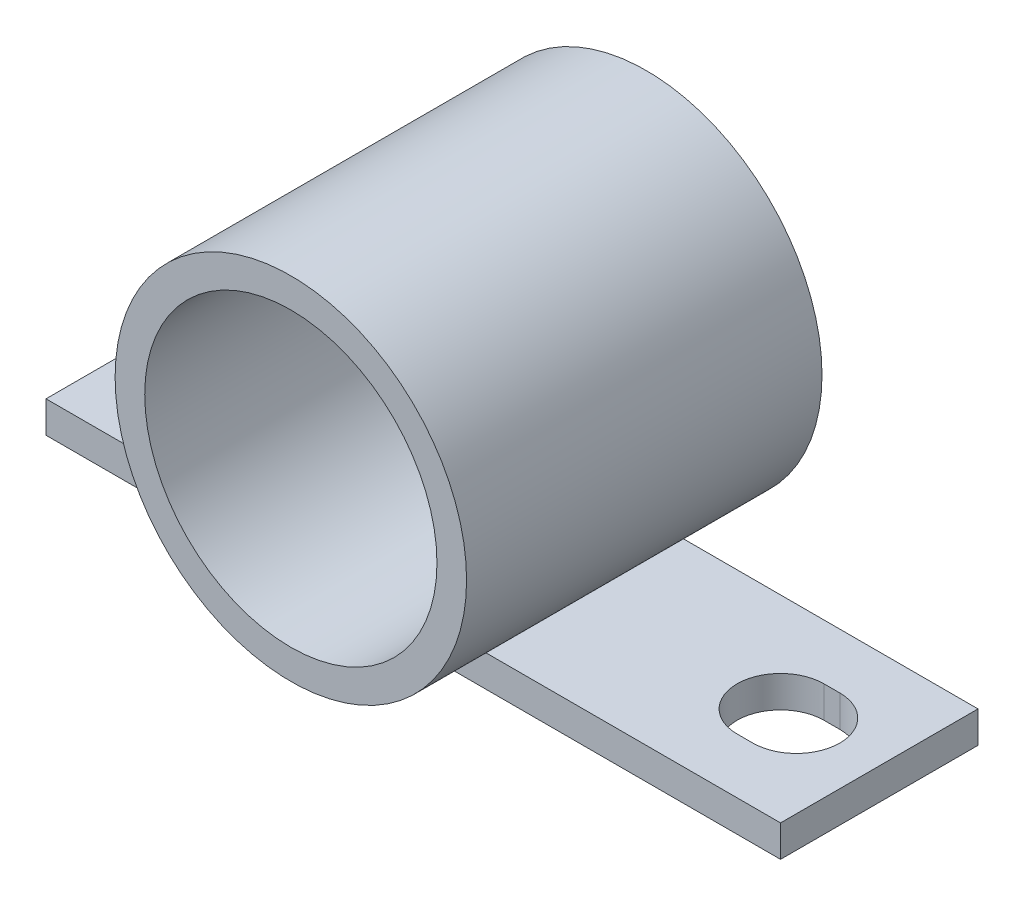
ISO-10303-21;
HEADER;
FILE_DESCRIPTION(('STEP AP214'),'2;1');
FILE_NAME('part.step','',(''),(''),'','','');
FILE_SCHEMA(('AUTOMOTIVE_DESIGN { 1 0 10303 214 1 1 1 1 }'));
ENDSEC;
DATA;
#1=APPLICATION_CONTEXT('core data for automotive mechanical design processes');
#2=APPLICATION_PROTOCOL_DEFINITION('international standard','automotive_design',2000,#1);
#3=PRODUCT_CONTEXT('',#1,'mechanical');
#4=PRODUCT('Part','Part','',(#3));
#5=PRODUCT_RELATED_PRODUCT_CATEGORY('part','',(#4));
#6=PRODUCT_DEFINITION_FORMATION('','',#4);
#7=PRODUCT_DEFINITION_CONTEXT('part definition',#1,'design');
#8=PRODUCT_DEFINITION('design','',#6,#7);
#9=PRODUCT_DEFINITION_SHAPE('','',#8);
#10=(LENGTH_UNIT() NAMED_UNIT(*) SI_UNIT(.MILLI.,.METRE.));
#11=(NAMED_UNIT(*) PLANE_ANGLE_UNIT() SI_UNIT($,.RADIAN.));
#12=(NAMED_UNIT(*) SI_UNIT($,.STERADIAN.) SOLID_ANGLE_UNIT());
#13=UNCERTAINTY_MEASURE_WITH_UNIT(LENGTH_MEASURE(1.E-05),#10,'distance_accuracy_value','');
#14=(GEOMETRIC_REPRESENTATION_CONTEXT(3) GLOBAL_UNCERTAINTY_ASSIGNED_CONTEXT((#13)) GLOBAL_UNIT_ASSIGNED_CONTEXT((#10,
#11,#12)) REPRESENTATION_CONTEXT('',''));
#15=CARTESIAN_POINT('',(0.,0.,0.));
#16=DIRECTION('',(0.,0.,1.));
#17=DIRECTION('',(1.,0.,0.));
#18=AXIS2_PLACEMENT_3D('',#15,#16,#17);
#19=CARTESIAN_POINT('',(0.,26.2500000000004,-17.0000000000001));
#20=DIRECTION('',(0.,0.,1.));
#21=DIRECTION('',(1.,0.,0.));
#22=AXIS2_PLACEMENT_3D('',#19,#20,#21);
#23=CYLINDRICAL_SURFACE('',#22,22.25);
#24=CARTESIAN_POINT('',(0.,26.2500000000004,-17.0000000000001));
#25=DIRECTION('',(0.,0.,1.));
#26=DIRECTION('',(1.,0.,0.));
#27=AXIS2_PLACEMENT_3D('',#24,#25,#26);
#28=CIRCLE('',#27,22.25);
#29=CARTESIAN_POINT('',(22.25,26.2500000000004,-17.0000000000001));
#30=VERTEX_POINT('',#29);
#31=EDGE_CURVE('E11',#30,#30,#28,.T.);
#32=ORIENTED_EDGE('',*,*,#31,.T.);
#33=EDGE_LOOP('',(#32));
#34=FACE_BOUND('',#33,.T.);
#35=CARTESIAN_POINT('',(0.,26.25,28.));
#36=DIRECTION('',(0.,0.,1.));
#37=DIRECTION('',(1.,0.,0.));
#38=AXIS2_PLACEMENT_3D('',#35,#36,#37);
#39=CIRCLE('',#38,22.25);
#40=CARTESIAN_POINT('',(22.25,26.25,28.));
#41=VERTEX_POINT('',#40);
#42=EDGE_CURVE('E54',#41,#41,#39,.T.);
#43=ORIENTED_EDGE('',*,*,#42,.F.);
#44=EDGE_LOOP('',(#43));
#45=FACE_BOUND('',#44,.T.);
#46=ADVANCED_FACE('F44',(#34,#45),#23,.T.);
#47=CARTESIAN_POINT('',(0.,26.2500000000004,-17.0000000000001));
#48=DIRECTION('',(0.,0.,1.));
#49=DIRECTION('',(1.,0.,0.));
#50=AXIS2_PLACEMENT_3D('',#47,#48,#49);
#51=PLANE('',#50);
#52=CARTESIAN_POINT('',(0.,26.2500000000004,-17.0000000000001));
#53=DIRECTION('',(0.,0.,1.));
#54=DIRECTION('',(1.,0.,0.));
#55=AXIS2_PLACEMENT_3D('',#52,#53,#54);
#56=CIRCLE('',#55,18.5);
#57=CARTESIAN_POINT('',(18.5,26.2500000000004,-17.0000000000001));
#58=VERTEX_POINT('',#57);
#59=EDGE_CURVE('E50',#58,#58,#56,.T.);
#60=ORIENTED_EDGE('',*,*,#59,.T.);
#61=EDGE_LOOP('',(#60));
#62=FACE_BOUND('',#61,.T.);
#63=ORIENTED_EDGE('',*,*,#31,.F.);
#64=EDGE_LOOP('',(#63));
#65=FACE_BOUND('',#64,.T.);
#66=ADVANCED_FACE('F73',(#62,#65),#51,.F.);
#67=CARTESIAN_POINT('',(0.,26.2500000000004,-17.0000000000001));
#68=DIRECTION('',(0.,0.,1.));
#69=DIRECTION('',(1.,0.,0.));
#70=AXIS2_PLACEMENT_3D('',#67,#68,#69);
#71=CYLINDRICAL_SURFACE('',#70,18.5);
#72=ORIENTED_EDGE('',*,*,#59,.F.);
#73=EDGE_LOOP('',(#72));
#74=FACE_BOUND('',#73,.T.);
#75=CARTESIAN_POINT('',(0.,26.25,28.));
#76=DIRECTION('',(0.,0.,1.));
#77=DIRECTION('',(1.,0.,0.));
#78=AXIS2_PLACEMENT_3D('',#75,#76,#77);
#79=CIRCLE('',#78,18.5);
#80=CARTESIAN_POINT('',(18.5,26.25,28.));
#81=VERTEX_POINT('',#80);
#82=EDGE_CURVE('E58',#81,#81,#79,.T.);
#83=ORIENTED_EDGE('',*,*,#82,.T.);
#84=EDGE_LOOP('',(#83));
#85=FACE_BOUND('',#84,.T.);
#86=ADVANCED_FACE('F64',(#74,#85),#71,.F.);
#87=CARTESIAN_POINT('',(0.,26.25,28.));
#88=DIRECTION('',(0.,0.,1.));
#89=DIRECTION('',(1.,0.,0.));
#90=AXIS2_PLACEMENT_3D('',#87,#88,#89);
#91=PLANE('',#90);
#92=ORIENTED_EDGE('',*,*,#42,.T.);
#93=EDGE_LOOP('',(#92));
#94=FACE_BOUND('',#93,.T.);
#95=ORIENTED_EDGE('',*,*,#82,.F.);
#96=EDGE_LOOP('',(#95));
#97=FACE_BOUND('',#96,.T.);
#98=ADVANCED_FACE('F66',(#94,#97),#91,.T.);
#99=CLOSED_SHELL('',(#46,#66,#86,#98));
#100=MANIFOLD_SOLID_BREP('B2',#99);
#101=CARTESIAN_POINT('',(0.,4.,0.));
#102=DIRECTION('',(0.,-1.,0.));
#103=DIRECTION('',(0.,0.,-1.));
#104=AXIS2_PLACEMENT_3D('',#101,#102,#103);
#105=PLANE('',#104);
#106=CARTESIAN_POINT('',(36.,4.,-8.88178419700125E-13));
#107=DIRECTION('',(0.,1.,0.));
#108=DIRECTION('',(0.,0.,-1.));
#109=AXIS2_PLACEMENT_3D('',#106,#107,#108);
#110=CIRCLE('',#109,5.49999999999998);
#111=CARTESIAN_POINT('',(36.,4.,5.49999999999917));
#112=VERTEX_POINT('',#111);
#113=CARTESIAN_POINT('',(36.,4.,-5.50000000000095));
#114=VERTEX_POINT('',#113);
#115=EDGE_CURVE('E222',#112,#114,#110,.T.);
#116=ORIENTED_EDGE('',*,*,#115,.F.);
#117=DIRECTION('',(1.,0.,0.));
#118=VECTOR('',#117,1.);
#119=CARTESIAN_POINT('',(36.,4.,5.49999999999917));
#120=LINE('',#119,#118);
#121=CARTESIAN_POINT('',(34.,4.,5.49999999999917));
#122=VERTEX_POINT('',#121);
#123=EDGE_CURVE('E230',#122,#112,#120,.T.);
#124=ORIENTED_EDGE('',*,*,#123,.F.);
#125=CARTESIAN_POINT('',(34.,4.,-8.88178419700125E-13));
#126=DIRECTION('',(0.,1.,0.));
#127=DIRECTION('',(0.,0.,-1.));
#128=AXIS2_PLACEMENT_3D('',#125,#126,#127);
#129=CIRCLE('',#128,5.49999999999998);
#130=CARTESIAN_POINT('',(34.,4.,-5.50000000000095));
#131=VERTEX_POINT('',#130);
#132=EDGE_CURVE('E227',#131,#122,#129,.T.);
#133=ORIENTED_EDGE('',*,*,#132,.F.);
#134=DIRECTION('',(-1.,0.,0.));
#135=VECTOR('',#134,1.);
#136=CARTESIAN_POINT('',(36.,4.,-5.50000000000095));
#137=LINE('',#136,#135);
#138=EDGE_CURVE('E224',#114,#131,#137,.T.);
#139=ORIENTED_EDGE('',*,*,#138,.F.);
#140=EDGE_LOOP('',(#116,#124,#133,#139));
#141=FACE_BOUND('',#140,.T.);
#142=DIRECTION('',(0.,0.,-1.));
#143=VECTOR('',#142,1.);
#144=CARTESIAN_POINT('',(46.5,4.,12.4999999999991));
#145=LINE('',#144,#143);
#146=CARTESIAN_POINT('',(46.5,4.,12.4999999999991));
#147=VERTEX_POINT('',#146);
#148=CARTESIAN_POINT('',(46.5,4.,-12.5000000000008));
#149=VERTEX_POINT('',#148);
#150=EDGE_CURVE('E253',#147,#149,#145,.T.);
#151=ORIENTED_EDGE('',*,*,#150,.T.);
#152=DIRECTION('',(-1.,0.,0.));
#153=VECTOR('',#152,1.);
#154=CARTESIAN_POINT('',(-46.5,4.,-12.5));
#155=LINE('',#154,#153);
#156=CARTESIAN_POINT('',(-46.5,4.,-12.5));
#157=VERTEX_POINT('',#156);
#158=EDGE_CURVE('E256',#149,#157,#155,.T.);
#159=ORIENTED_EDGE('',*,*,#158,.T.);
#160=DIRECTION('',(0.,0.,1.));
#161=VECTOR('',#160,1.);
#162=CARTESIAN_POINT('',(-46.5,4.,12.5));
#163=LINE('',#162,#161);
#164=CARTESIAN_POINT('',(-46.5,4.,12.5));
#165=VERTEX_POINT('',#164);
#166=EDGE_CURVE('E259',#157,#165,#163,.T.);
#167=ORIENTED_EDGE('',*,*,#166,.T.);
#168=DIRECTION('',(1.,0.,0.));
#169=VECTOR('',#168,1.);
#170=CARTESIAN_POINT('',(-46.5,4.,12.5));
#171=LINE('',#170,#169);
#172=EDGE_CURVE('E261',#165,#147,#171,.T.);
#173=ORIENTED_EDGE('',*,*,#172,.T.);
#174=EDGE_LOOP('',(#151,#159,#167,#173));
#175=FACE_BOUND('',#174,.T.);
#176=CARTESIAN_POINT('',(-36.,4.,0.));
#177=DIRECTION('',(0.,1.,0.));
#178=DIRECTION('',(0.,0.,1.));
#179=AXIS2_PLACEMENT_3D('',#176,#177,#178);
#180=CIRCLE('',#179,5.49999999999998);
#181=CARTESIAN_POINT('',(-36.,4.,-5.50000000000006));
#182=VERTEX_POINT('',#181);
#183=CARTESIAN_POINT('',(-36.,4.,5.50000000000006));
#184=VERTEX_POINT('',#183);
#185=EDGE_CURVE('E186',#182,#184,#180,.T.);
#186=ORIENTED_EDGE('',*,*,#185,.F.);
#187=DIRECTION('',(-1.,0.,0.));
#188=VECTOR('',#187,1.);
#189=CARTESIAN_POINT('',(-36.,4.,-5.50000000000006));
#190=LINE('',#189,#188);
#191=CARTESIAN_POINT('',(-34.,4.,-5.50000000000006));
#192=VERTEX_POINT('',#191);
#193=EDGE_CURVE('E208',#192,#182,#190,.T.);
#194=ORIENTED_EDGE('',*,*,#193,.F.);
#195=CARTESIAN_POINT('',(-34.,4.,0.));
#196=DIRECTION('',(0.,1.,0.));
#197=DIRECTION('',(0.,0.,1.));
#198=AXIS2_PLACEMENT_3D('',#195,#196,#197);
#199=CIRCLE('',#198,5.49999999999998);
#200=CARTESIAN_POINT('',(-34.,4.,5.50000000000006));
#201=VERTEX_POINT('',#200);
#202=EDGE_CURVE('E206',#201,#192,#199,.T.);
#203=ORIENTED_EDGE('',*,*,#202,.F.);
#204=DIRECTION('',(1.,0.,0.));
#205=VECTOR('',#204,1.);
#206=CARTESIAN_POINT('',(-36.,4.,5.50000000000006));
#207=LINE('',#206,#205);
#208=EDGE_CURVE('E194',#184,#201,#207,.T.);
#209=ORIENTED_EDGE('',*,*,#208,.F.);
#210=EDGE_LOOP('',(#186,#194,#203,#209));
#211=FACE_BOUND('',#210,.T.);
#212=ADVANCED_FACE('F97',(#141,#175,#211),#105,.F.);
#213=CARTESIAN_POINT('',(0.,0.,0.));
#214=DIRECTION('',(0.,-1.,0.));
#215=DIRECTION('',(0.,0.,-1.));
#216=AXIS2_PLACEMENT_3D('',#213,#214,#215);
#217=PLANE('',#216);
#218=DIRECTION('',(0.,0.,-1.));
#219=VECTOR('',#218,1.);
#220=CARTESIAN_POINT('',(46.5,0.,12.4999999999991));
#221=LINE('',#220,#219);
#222=CARTESIAN_POINT('',(46.5,0.,12.4999999999991));
#223=VERTEX_POINT('',#222);
#224=CARTESIAN_POINT('',(46.5,0.,-12.5000000000008));
#225=VERTEX_POINT('',#224);
#226=EDGE_CURVE('E252',#223,#225,#221,.T.);
#227=ORIENTED_EDGE('',*,*,#226,.F.);
#228=DIRECTION('',(1.,0.,0.));
#229=VECTOR('',#228,1.);
#230=CARTESIAN_POINT('',(-46.5,0.,12.5));
#231=LINE('',#230,#229);
#232=CARTESIAN_POINT('',(-46.5,0.,12.5));
#233=VERTEX_POINT('',#232);
#234=EDGE_CURVE('E257',#233,#223,#231,.T.);
#235=ORIENTED_EDGE('',*,*,#234,.F.);
#236=DIRECTION('',(0.,0.,1.));
#237=VECTOR('',#236,1.);
#238=CARTESIAN_POINT('',(-46.5,0.,12.5));
#239=LINE('',#238,#237);
#240=CARTESIAN_POINT('',(-46.5,0.,-12.5));
#241=VERTEX_POINT('',#240);
#242=EDGE_CURVE('E268',#241,#233,#239,.T.);
#243=ORIENTED_EDGE('',*,*,#242,.F.);
#244=DIRECTION('',(-1.,0.,0.));
#245=VECTOR('',#244,1.);
#246=CARTESIAN_POINT('',(-46.5,0.,-12.5));
#247=LINE('',#246,#245);
#248=EDGE_CURVE('E266',#225,#241,#247,.T.);
#249=ORIENTED_EDGE('',*,*,#248,.F.);
#250=EDGE_LOOP('',(#227,#235,#243,#249));
#251=FACE_BOUND('',#250,.T.);
#252=DIRECTION('',(1.,0.,0.));
#253=VECTOR('',#252,1.);
#254=CARTESIAN_POINT('',(36.,0.,5.49999999999917));
#255=LINE('',#254,#253);
#256=CARTESIAN_POINT('',(34.,0.,5.49999999999917));
#257=VERTEX_POINT('',#256);
#258=CARTESIAN_POINT('',(36.,0.,5.49999999999917));
#259=VERTEX_POINT('',#258);
#260=EDGE_CURVE('E225',#257,#259,#255,.T.);
#261=ORIENTED_EDGE('',*,*,#260,.T.);
#262=CARTESIAN_POINT('',(36.,0.,-8.88178419700125E-13));
#263=DIRECTION('',(0.,1.,0.));
#264=DIRECTION('',(0.,0.,-1.));
#265=AXIS2_PLACEMENT_3D('',#262,#263,#264);
#266=CIRCLE('',#265,5.49999999999998);
#267=CARTESIAN_POINT('',(36.,0.,-5.50000000000095));
#268=VERTEX_POINT('',#267);
#269=EDGE_CURVE('E202',#259,#268,#266,.T.);
#270=ORIENTED_EDGE('',*,*,#269,.T.);
#271=DIRECTION('',(-1.,0.,0.));
#272=VECTOR('',#271,1.);
#273=CARTESIAN_POINT('',(36.,0.,-5.50000000000095));
#274=LINE('',#273,#272);
#275=CARTESIAN_POINT('',(34.,0.,-5.50000000000095));
#276=VERTEX_POINT('',#275);
#277=EDGE_CURVE('E235',#268,#276,#274,.T.);
#278=ORIENTED_EDGE('',*,*,#277,.T.);
#279=CARTESIAN_POINT('',(34.,0.,-8.88178419700125E-13));
#280=DIRECTION('',(0.,1.,0.));
#281=DIRECTION('',(0.,0.,-1.));
#282=AXIS2_PLACEMENT_3D('',#279,#280,#281);
#283=CIRCLE('',#282,5.49999999999998);
#284=EDGE_CURVE('E238',#276,#257,#283,.T.);
#285=ORIENTED_EDGE('',*,*,#284,.T.);
#286=EDGE_LOOP('',(#261,#270,#278,#285));
#287=FACE_BOUND('',#286,.T.);
#288=DIRECTION('',(-1.,0.,0.));
#289=VECTOR('',#288,1.);
#290=CARTESIAN_POINT('',(-36.,0.,-5.50000000000006));
#291=LINE('',#290,#289);
#292=CARTESIAN_POINT('',(-34.,0.,-5.50000000000006));
#293=VERTEX_POINT('',#292);
#294=CARTESIAN_POINT('',(-36.,0.,-5.50000000000006));
#295=VERTEX_POINT('',#294);
#296=EDGE_CURVE('E195',#293,#295,#291,.T.);
#297=ORIENTED_EDGE('',*,*,#296,.T.);
#298=CARTESIAN_POINT('',(-36.,0.,0.));
#299=DIRECTION('',(0.,1.,0.));
#300=DIRECTION('',(0.,0.,1.));
#301=AXIS2_PLACEMENT_3D('',#298,#299,#300);
#302=CIRCLE('',#301,5.49999999999998);
#303=CARTESIAN_POINT('',(-36.,0.,5.50000000000006));
#304=VERTEX_POINT('',#303);
#305=EDGE_CURVE('E120',#295,#304,#302,.T.);
#306=ORIENTED_EDGE('',*,*,#305,.T.);
#307=DIRECTION('',(1.,0.,0.));
#308=VECTOR('',#307,1.);
#309=CARTESIAN_POINT('',(-36.,0.,5.50000000000006));
#310=LINE('',#309,#308);
#311=CARTESIAN_POINT('',(-34.,0.,5.50000000000006));
#312=VERTEX_POINT('',#311);
#313=EDGE_CURVE('E201',#304,#312,#310,.T.);
#314=ORIENTED_EDGE('',*,*,#313,.T.);
#315=CARTESIAN_POINT('',(-34.,0.,0.));
#316=DIRECTION('',(0.,1.,0.));
#317=DIRECTION('',(0.,0.,1.));
#318=AXIS2_PLACEMENT_3D('',#315,#316,#317);
#319=CIRCLE('',#318,5.49999999999998);
#320=EDGE_CURVE('E214',#312,#293,#319,.T.);
#321=ORIENTED_EDGE('',*,*,#320,.T.);
#322=EDGE_LOOP('',(#297,#306,#314,#321));
#323=FACE_BOUND('',#322,.T.);
#324=ADVANCED_FACE('F286',(#251,#287,#323),#217,.T.);
#325=CARTESIAN_POINT('',(46.5,4.,12.4999999999991));
#326=DIRECTION('',(-1.,0.,0.));
#327=DIRECTION('',(0.,0.,1.));
#328=AXIS2_PLACEMENT_3D('',#325,#326,#327);
#329=PLANE('',#328);
#330=ORIENTED_EDGE('',*,*,#226,.T.);
#331=DIRECTION('',(0.,-1.,0.));
#332=VECTOR('',#331,1.);
#333=CARTESIAN_POINT('',(46.5,4.,-12.5000000000008));
#334=LINE('',#333,#332);
#335=EDGE_CURVE('E42',#149,#225,#334,.T.);
#336=ORIENTED_EDGE('',*,*,#335,.F.);
#337=ORIENTED_EDGE('',*,*,#150,.F.);
#338=DIRECTION('',(0.,-1.,0.));
#339=VECTOR('',#338,1.);
#340=CARTESIAN_POINT('',(46.5,4.,12.4999999999991));
#341=LINE('',#340,#339);
#342=EDGE_CURVE('E263',#147,#223,#341,.T.);
#343=ORIENTED_EDGE('',*,*,#342,.T.);
#344=EDGE_LOOP('',(#330,#336,#337,#343));
#345=FACE_BOUND('',#344,.T.);
#346=ADVANCED_FACE('F99',(#345),#329,.F.);
#347=CARTESIAN_POINT('',(-46.5,4.,-12.5));
#348=DIRECTION('',(0.,0.,1.));
#349=DIRECTION('',(1.,0.,0.));
#350=AXIS2_PLACEMENT_3D('',#347,#348,#349);
#351=PLANE('',#350);
#352=ORIENTED_EDGE('',*,*,#248,.T.);
#353=DIRECTION('',(0.,-1.,0.));
#354=VECTOR('',#353,1.);
#355=CARTESIAN_POINT('',(-46.5,4.,-12.5));
#356=LINE('',#355,#354);
#357=EDGE_CURVE('E105',#157,#241,#356,.T.);
#358=ORIENTED_EDGE('',*,*,#357,.F.);
#359=ORIENTED_EDGE('',*,*,#158,.F.);
#360=ORIENTED_EDGE('',*,*,#335,.T.);
#361=EDGE_LOOP('',(#352,#358,#359,#360));
#362=FACE_BOUND('',#361,.T.);
#363=ADVANCED_FACE('F296',(#362),#351,.F.);
#364=CARTESIAN_POINT('',(-46.5,4.,12.5));
#365=DIRECTION('',(1.,0.,0.));
#366=DIRECTION('',(0.,0.,-1.));
#367=AXIS2_PLACEMENT_3D('',#364,#365,#366);
#368=PLANE('',#367);
#369=ORIENTED_EDGE('',*,*,#242,.T.);
#370=DIRECTION('',(0.,-1.,0.));
#371=VECTOR('',#370,1.);
#372=CARTESIAN_POINT('',(-46.5,4.,12.5));
#373=LINE('',#372,#371);
#374=EDGE_CURVE('E273',#165,#233,#373,.T.);
#375=ORIENTED_EDGE('',*,*,#374,.F.);
#376=ORIENTED_EDGE('',*,*,#166,.F.);
#377=ORIENTED_EDGE('',*,*,#357,.T.);
#378=EDGE_LOOP('',(#369,#375,#376,#377));
#379=FACE_BOUND('',#378,.T.);
#380=ADVANCED_FACE('F280',(#379),#368,.F.);
#381=CARTESIAN_POINT('',(-46.5,4.,12.5));
#382=DIRECTION('',(0.,0.,-1.));
#383=DIRECTION('',(-1.,0.,0.));
#384=AXIS2_PLACEMENT_3D('',#381,#382,#383);
#385=PLANE('',#384);
#386=ORIENTED_EDGE('',*,*,#234,.T.);
#387=ORIENTED_EDGE('',*,*,#342,.F.);
#388=ORIENTED_EDGE('',*,*,#172,.F.);
#389=ORIENTED_EDGE('',*,*,#374,.T.);
#390=EDGE_LOOP('',(#386,#387,#388,#389));
#391=FACE_BOUND('',#390,.T.);
#392=ADVANCED_FACE('F290',(#391),#385,.F.);
#393=CARTESIAN_POINT('',(36.,4.,-8.88178419700125E-13));
#394=DIRECTION('',(0.,-1.,0.));
#395=DIRECTION('',(0.,0.,-1.));
#396=AXIS2_PLACEMENT_3D('',#393,#394,#395);
#397=CYLINDRICAL_SURFACE('',#396,5.49999999999998);
#398=ORIENTED_EDGE('',*,*,#269,.F.);
#399=DIRECTION('',(0.,-1.,0.));
#400=VECTOR('',#399,1.);
#401=CARTESIAN_POINT('',(36.,4.,5.49999999999917));
#402=LINE('',#401,#400);
#403=EDGE_CURVE('E232',#112,#259,#402,.T.);
#404=ORIENTED_EDGE('',*,*,#403,.F.);
#405=ORIENTED_EDGE('',*,*,#115,.T.);
#406=DIRECTION('',(0.,-1.,0.));
#407=VECTOR('',#406,1.);
#408=CARTESIAN_POINT('',(36.,4.,-5.50000000000095));
#409=LINE('',#408,#407);
#410=EDGE_CURVE('E249',#114,#268,#409,.T.);
#411=ORIENTED_EDGE('',*,*,#410,.T.);
#412=EDGE_LOOP('',(#398,#404,#405,#411));
#413=FACE_BOUND('',#412,.T.);
#414=ADVANCED_FACE('F312',(#413),#397,.F.);
#415=CARTESIAN_POINT('',(36.,4.,-5.50000000000095));
#416=DIRECTION('',(0.,0.,1.));
#417=DIRECTION('',(1.,0.,0.));
#418=AXIS2_PLACEMENT_3D('',#415,#416,#417);
#419=PLANE('',#418);
#420=ORIENTED_EDGE('',*,*,#277,.F.);
#421=ORIENTED_EDGE('',*,*,#410,.F.);
#422=ORIENTED_EDGE('',*,*,#138,.T.);
#423=DIRECTION('',(0.,-1.,0.));
#424=VECTOR('',#423,1.);
#425=CARTESIAN_POINT('',(34.,4.,-5.50000000000095));
#426=LINE('',#425,#424);
#427=EDGE_CURVE('E247',#131,#276,#426,.T.);
#428=ORIENTED_EDGE('',*,*,#427,.T.);
#429=EDGE_LOOP('',(#420,#421,#422,#428));
#430=FACE_BOUND('',#429,.T.);
#431=ADVANCED_FACE('F319',(#430),#419,.T.);
#432=CARTESIAN_POINT('',(34.,4.,-8.88178419700125E-13));
#433=DIRECTION('',(0.,-1.,0.));
#434=DIRECTION('',(0.,0.,-1.));
#435=AXIS2_PLACEMENT_3D('',#432,#433,#434);
#436=CYLINDRICAL_SURFACE('',#435,5.49999999999998);
#437=ORIENTED_EDGE('',*,*,#284,.F.);
#438=ORIENTED_EDGE('',*,*,#427,.F.);
#439=ORIENTED_EDGE('',*,*,#132,.T.);
#440=DIRECTION('',(0.,-1.,0.));
#441=VECTOR('',#440,1.);
#442=CARTESIAN_POINT('',(34.,4.,5.49999999999917));
#443=LINE('',#442,#441);
#444=EDGE_CURVE('E245',#122,#257,#443,.T.);
#445=ORIENTED_EDGE('',*,*,#444,.T.);
#446=EDGE_LOOP('',(#437,#438,#439,#445));
#447=FACE_BOUND('',#446,.T.);
#448=ADVANCED_FACE('F324',(#447),#436,.F.);
#449=CARTESIAN_POINT('',(36.,4.,5.49999999999917));
#450=DIRECTION('',(0.,0.,-1.));
#451=DIRECTION('',(-1.,0.,0.));
#452=AXIS2_PLACEMENT_3D('',#449,#450,#451);
#453=PLANE('',#452);
#454=ORIENTED_EDGE('',*,*,#260,.F.);
#455=ORIENTED_EDGE('',*,*,#444,.F.);
#456=ORIENTED_EDGE('',*,*,#123,.T.);
#457=ORIENTED_EDGE('',*,*,#403,.T.);
#458=EDGE_LOOP('',(#454,#455,#456,#457));
#459=FACE_BOUND('',#458,.T.);
#460=ADVANCED_FACE('F330',(#459),#453,.T.);
#461=CARTESIAN_POINT('',(-36.,4.,0.));
#462=DIRECTION('',(0.,-1.,0.));
#463=DIRECTION('',(0.,0.,-1.));
#464=AXIS2_PLACEMENT_3D('',#461,#462,#463);
#465=CYLINDRICAL_SURFACE('',#464,5.49999999999998);
#466=ORIENTED_EDGE('',*,*,#305,.F.);
#467=DIRECTION('',(0.,-1.,0.));
#468=VECTOR('',#467,1.);
#469=CARTESIAN_POINT('',(-36.,4.,-5.50000000000006));
#470=LINE('',#469,#468);
#471=EDGE_CURVE('E190',#182,#295,#470,.T.);
#472=ORIENTED_EDGE('',*,*,#471,.F.);
#473=ORIENTED_EDGE('',*,*,#185,.T.);
#474=DIRECTION('',(0.,-1.,0.));
#475=VECTOR('',#474,1.);
#476=CARTESIAN_POINT('',(-36.,4.,5.50000000000006));
#477=LINE('',#476,#475);
#478=EDGE_CURVE('E189',#184,#304,#477,.T.);
#479=ORIENTED_EDGE('',*,*,#478,.T.);
#480=EDGE_LOOP('',(#466,#472,#473,#479));
#481=FACE_BOUND('',#480,.T.);
#482=ADVANCED_FACE('F188',(#481),#465,.F.);
#483=CARTESIAN_POINT('',(-36.,4.,5.50000000000006));
#484=DIRECTION('',(0.,0.,-1.));
#485=DIRECTION('',(-1.,0.,0.));
#486=AXIS2_PLACEMENT_3D('',#483,#484,#485);
#487=PLANE('',#486);
#488=ORIENTED_EDGE('',*,*,#313,.F.);
#489=ORIENTED_EDGE('',*,*,#478,.F.);
#490=ORIENTED_EDGE('',*,*,#208,.T.);
#491=DIRECTION('',(0.,-1.,0.));
#492=VECTOR('',#491,1.);
#493=CARTESIAN_POINT('',(-34.,4.,5.50000000000006));
#494=LINE('',#493,#492);
#495=EDGE_CURVE('E203',#201,#312,#494,.T.);
#496=ORIENTED_EDGE('',*,*,#495,.T.);
#497=EDGE_LOOP('',(#488,#489,#490,#496));
#498=FACE_BOUND('',#497,.T.);
#499=ADVANCED_FACE('F198',(#498),#487,.T.);
#500=CARTESIAN_POINT('',(-34.,4.,0.));
#501=DIRECTION('',(0.,-1.,0.));
#502=DIRECTION('',(0.,0.,-1.));
#503=AXIS2_PLACEMENT_3D('',#500,#501,#502);
#504=CYLINDRICAL_SURFACE('',#503,5.49999999999998);
#505=ORIENTED_EDGE('',*,*,#320,.F.);
#506=ORIENTED_EDGE('',*,*,#495,.F.);
#507=ORIENTED_EDGE('',*,*,#202,.T.);
#508=DIRECTION('',(0.,-1.,0.));
#509=VECTOR('',#508,1.);
#510=CARTESIAN_POINT('',(-34.,4.,-5.50000000000006));
#511=LINE('',#510,#509);
#512=EDGE_CURVE('E112',#192,#293,#511,.T.);
#513=ORIENTED_EDGE('',*,*,#512,.T.);
#514=EDGE_LOOP('',(#505,#506,#507,#513));
#515=FACE_BOUND('',#514,.T.);
#516=ADVANCED_FACE('F349',(#515),#504,.F.);
#517=CARTESIAN_POINT('',(-36.,4.,-5.50000000000006));
#518=DIRECTION('',(0.,0.,1.));
#519=DIRECTION('',(1.,0.,0.));
#520=AXIS2_PLACEMENT_3D('',#517,#518,#519);
#521=PLANE('',#520);
#522=ORIENTED_EDGE('',*,*,#296,.F.);
#523=ORIENTED_EDGE('',*,*,#512,.F.);
#524=ORIENTED_EDGE('',*,*,#193,.T.);
#525=ORIENTED_EDGE('',*,*,#471,.T.);
#526=EDGE_LOOP('',(#522,#523,#524,#525));
#527=FACE_BOUND('',#526,.T.);
#528=ADVANCED_FACE('F352',(#527),#521,.T.);
#529=CLOSED_SHELL('',(#212,#324,#346,#363,#380,#392,#414,#431,#448,#460,#482,#499,#516,#528));
#530=MANIFOLD_SOLID_BREP('B6',#529);
#531=ADVANCED_BREP_SHAPE_REPRESENTATION('',(#18,#100,#530),#14);
#532=SHAPE_DEFINITION_REPRESENTATION(#9,#531);
ENDSEC;
END-ISO-10303-21;
